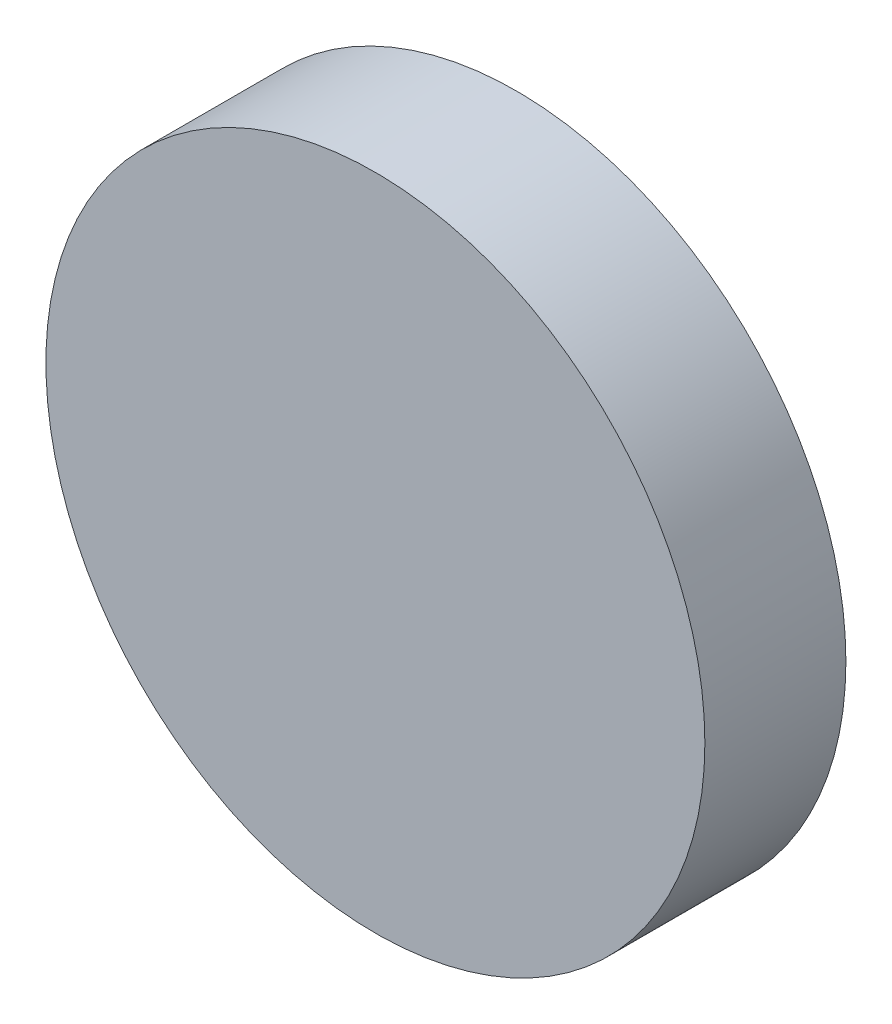
ISO-10303-21;
HEADER;
FILE_DESCRIPTION(('STEP AP214'),'2;1');
FILE_NAME('part.step','',(''),(''),'','','');
FILE_SCHEMA(('AUTOMOTIVE_DESIGN { 1 0 10303 214 1 1 1 1 }'));
ENDSEC;
DATA;
#1=APPLICATION_CONTEXT('core data for automotive mechanical design processes');
#2=APPLICATION_PROTOCOL_DEFINITION('international standard','automotive_design',2000,#1);
#3=PRODUCT_CONTEXT('',#1,'mechanical');
#4=PRODUCT('Part','Part','',(#3));
#5=PRODUCT_RELATED_PRODUCT_CATEGORY('part','',(#4));
#6=PRODUCT_DEFINITION_FORMATION('','',#4);
#7=PRODUCT_DEFINITION_CONTEXT('part definition',#1,'design');
#8=PRODUCT_DEFINITION('design','',#6,#7);
#9=PRODUCT_DEFINITION_SHAPE('','',#8);
#10=(LENGTH_UNIT() NAMED_UNIT(*) SI_UNIT(.MILLI.,.METRE.));
#11=(NAMED_UNIT(*) PLANE_ANGLE_UNIT() SI_UNIT($,.RADIAN.));
#12=(NAMED_UNIT(*) SI_UNIT($,.STERADIAN.) SOLID_ANGLE_UNIT());
#13=UNCERTAINTY_MEASURE_WITH_UNIT(LENGTH_MEASURE(1.E-05),#10,'distance_accuracy_value','');
#14=(GEOMETRIC_REPRESENTATION_CONTEXT(3) GLOBAL_UNCERTAINTY_ASSIGNED_CONTEXT((#13)) GLOBAL_UNIT_ASSIGNED_CONTEXT((#10,
#11,#12)) REPRESENTATION_CONTEXT('',''));
#15=CARTESIAN_POINT('',(0.,0.,0.));
#16=DIRECTION('',(0.,0.,1.));
#17=DIRECTION('',(1.,0.,0.));
#18=AXIS2_PLACEMENT_3D('',#15,#16,#17);
#19=CARTESIAN_POINT('',(12.5,12.5,5.35));
#20=DIRECTION('',(0.,0.,-1.));
#21=DIRECTION('',(-1.,0.,0.));
#22=AXIS2_PLACEMENT_3D('',#19,#20,#21);
#23=CYLINDRICAL_SURFACE('',#22,12.5);
#24=CARTESIAN_POINT('',(12.5,12.5,5.35));
#25=DIRECTION('',(0.,0.,1.));
#26=DIRECTION('',(1.,0.,0.));
#27=AXIS2_PLACEMENT_3D('',#24,#25,#26);
#28=CIRCLE('',#27,12.5);
#29=CARTESIAN_POINT('',(25.,12.5,5.35));
#30=VERTEX_POINT('',#29);
#31=EDGE_CURVE('E10',#30,#30,#28,.T.);
#32=ORIENTED_EDGE('',*,*,#31,.F.);
#33=EDGE_LOOP('',(#32));
#34=FACE_BOUND('',#33,.T.);
#35=CARTESIAN_POINT('',(12.5,12.5,0.));
#36=DIRECTION('',(0.,0.,1.));
#37=DIRECTION('',(1.,0.,0.));
#38=AXIS2_PLACEMENT_3D('',#35,#36,#37);
#39=CIRCLE('',#38,12.5);
#40=CARTESIAN_POINT('',(25.,12.5,0.));
#41=VERTEX_POINT('',#40);
#42=EDGE_CURVE('E34',#41,#41,#39,.T.);
#43=ORIENTED_EDGE('',*,*,#42,.T.);
#44=EDGE_LOOP('',(#43));
#45=FACE_BOUND('',#44,.T.);
#46=ADVANCED_FACE('F31',(#34,#45),#23,.T.);
#47=CARTESIAN_POINT('',(12.5,12.5,5.35));
#48=DIRECTION('',(0.,0.,1.));
#49=DIRECTION('',(1.,0.,0.));
#50=AXIS2_PLACEMENT_3D('',#47,#48,#49);
#51=PLANE('',#50);
#52=ORIENTED_EDGE('',*,*,#31,.T.);
#53=EDGE_LOOP('',(#52));
#54=FACE_BOUND('',#53,.T.);
#55=ADVANCED_FACE('F46',(#54),#51,.T.);
#56=CARTESIAN_POINT('',(12.5,12.5,0.));
#57=DIRECTION('',(0.,0.,1.));
#58=DIRECTION('',(1.,0.,0.));
#59=AXIS2_PLACEMENT_3D('',#56,#57,#58);
#60=PLANE('',#59);
#61=ORIENTED_EDGE('',*,*,#42,.F.);
#62=EDGE_LOOP('',(#61));
#63=FACE_BOUND('',#62,.T.);
#64=ADVANCED_FACE('F44',(#63),#60,.F.);
#65=CLOSED_SHELL('',(#46,#55,#64));
#66=MANIFOLD_SOLID_BREP('B2',#65);
#67=ADVANCED_BREP_SHAPE_REPRESENTATION('',(#18,#66),#14);
#68=SHAPE_DEFINITION_REPRESENTATION(#9,#67);
ENDSEC;
END-ISO-10303-21;
